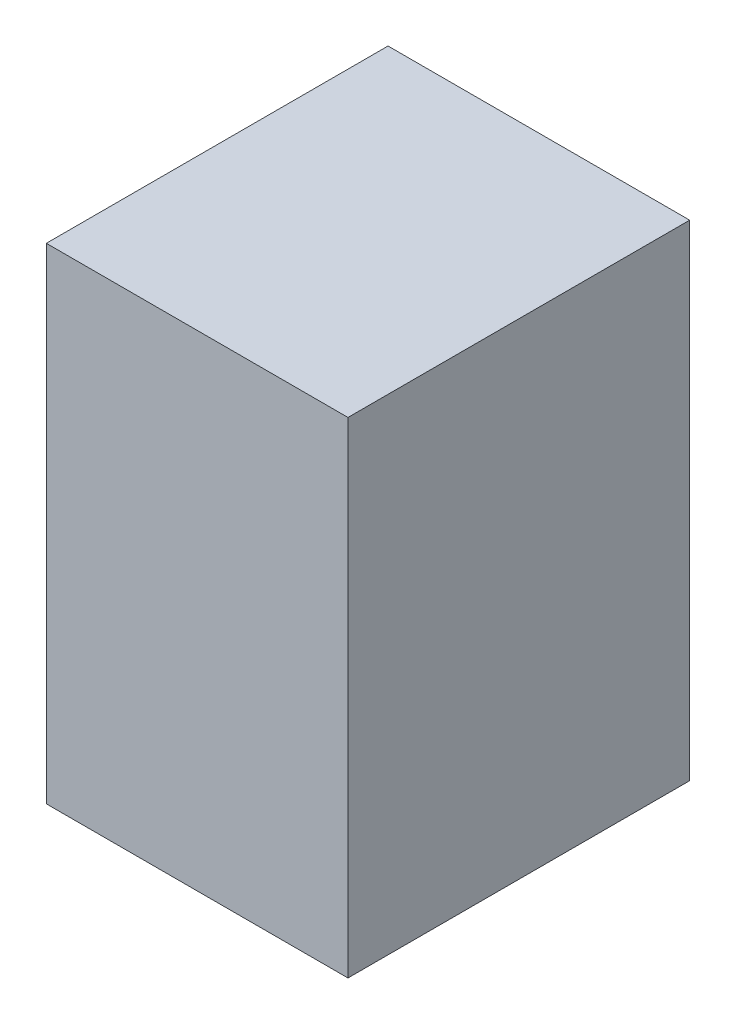
ISO-10303-21;
HEADER;
FILE_DESCRIPTION(('STEP AP214'),'2;1');
FILE_NAME('part.step','',(''),(''),'','','');
FILE_SCHEMA(('AUTOMOTIVE_DESIGN { 1 0 10303 214 1 1 1 1 }'));
ENDSEC;
DATA;
#1=APPLICATION_CONTEXT('core data for automotive mechanical design processes');
#2=APPLICATION_PROTOCOL_DEFINITION('international standard','automotive_design',2000,#1);
#3=PRODUCT_CONTEXT('',#1,'mechanical');
#4=PRODUCT('Part','Part','',(#3));
#5=PRODUCT_RELATED_PRODUCT_CATEGORY('part','',(#4));
#6=PRODUCT_DEFINITION_FORMATION('','',#4);
#7=PRODUCT_DEFINITION_CONTEXT('part definition',#1,'design');
#8=PRODUCT_DEFINITION('design','',#6,#7);
#9=PRODUCT_DEFINITION_SHAPE('','',#8);
#10=(LENGTH_UNIT() NAMED_UNIT(*) SI_UNIT(.MILLI.,.METRE.));
#11=(NAMED_UNIT(*) PLANE_ANGLE_UNIT() SI_UNIT($,.RADIAN.));
#12=(NAMED_UNIT(*) SI_UNIT($,.STERADIAN.) SOLID_ANGLE_UNIT());
#13=UNCERTAINTY_MEASURE_WITH_UNIT(LENGTH_MEASURE(1.E-05),#10,'distance_accuracy_value','');
#14=(GEOMETRIC_REPRESENTATION_CONTEXT(3) GLOBAL_UNCERTAINTY_ASSIGNED_CONTEXT((#13)) GLOBAL_UNIT_ASSIGNED_CONTEXT((#10,
#11,#12)) REPRESENTATION_CONTEXT('',''));
#15=CARTESIAN_POINT('',(0.,0.,0.));
#16=DIRECTION('',(0.,0.,1.));
#17=DIRECTION('',(1.,0.,0.));
#18=AXIS2_PLACEMENT_3D('',#15,#16,#17);
#19=CARTESIAN_POINT('',(32.,103.,36.25));
#20=DIRECTION('',(-1.,0.,0.));
#21=DIRECTION('',(0.,0.,1.));
#22=AXIS2_PLACEMENT_3D('',#19,#20,#21);
#23=PLANE('',#22);
#24=DIRECTION('',(0.,0.,-1.));
#25=VECTOR('',#24,1.);
#26=CARTESIAN_POINT('',(32.,0.,36.25));
#27=LINE('',#26,#25);
#28=CARTESIAN_POINT('',(32.,0.,36.25));
#29=VERTEX_POINT('',#28);
#30=CARTESIAN_POINT('',(32.,0.,-36.25));
#31=VERTEX_POINT('',#30);
#32=EDGE_CURVE('E100',#29,#31,#27,.T.);
#33=ORIENTED_EDGE('',*,*,#32,.T.);
#34=DIRECTION('',(0.,-1.,0.));
#35=VECTOR('',#34,1.);
#36=CARTESIAN_POINT('',(32.,103.,-36.25));
#37=LINE('',#36,#35);
#38=CARTESIAN_POINT('',(32.,103.,-36.25));
#39=VERTEX_POINT('',#38);
#40=EDGE_CURVE('E11',#39,#31,#37,.T.);
#41=ORIENTED_EDGE('',*,*,#40,.F.);
#42=DIRECTION('',(0.,0.,-1.));
#43=VECTOR('',#42,1.);
#44=CARTESIAN_POINT('',(32.,103.,36.25));
#45=LINE('',#44,#43);
#46=CARTESIAN_POINT('',(32.,103.,36.25));
#47=VERTEX_POINT('',#46);
#48=EDGE_CURVE('E88',#47,#39,#45,.T.);
#49=ORIENTED_EDGE('',*,*,#48,.F.);
#50=DIRECTION('',(0.,-1.,0.));
#51=VECTOR('',#50,1.);
#52=CARTESIAN_POINT('',(32.,103.,36.25));
#53=LINE('',#52,#51);
#54=EDGE_CURVE('E96',#47,#29,#53,.T.);
#55=ORIENTED_EDGE('',*,*,#54,.T.);
#56=EDGE_LOOP('',(#33,#41,#49,#55));
#57=FACE_BOUND('',#56,.T.);
#58=ADVANCED_FACE('F37',(#57),#23,.F.);
#59=CARTESIAN_POINT('',(-32.,103.,-36.25));
#60=DIRECTION('',(0.,0.,1.));
#61=DIRECTION('',(1.,0.,0.));
#62=AXIS2_PLACEMENT_3D('',#59,#60,#61);
#63=PLANE('',#62);
#64=DIRECTION('',(-1.,0.,0.));
#65=VECTOR('',#64,1.);
#66=CARTESIAN_POINT('',(-32.,0.,-36.25));
#67=LINE('',#66,#65);
#68=CARTESIAN_POINT('',(-32.,0.,-36.25));
#69=VERTEX_POINT('',#68);
#70=EDGE_CURVE('E92',#31,#69,#67,.T.);
#71=ORIENTED_EDGE('',*,*,#70,.T.);
#72=DIRECTION('',(0.,-1.,0.));
#73=VECTOR('',#72,1.);
#74=CARTESIAN_POINT('',(-32.,103.,-36.25));
#75=LINE('',#74,#73);
#76=CARTESIAN_POINT('',(-32.,103.,-36.25));
#77=VERTEX_POINT('',#76);
#78=EDGE_CURVE('E45',#77,#69,#75,.T.);
#79=ORIENTED_EDGE('',*,*,#78,.F.);
#80=DIRECTION('',(-1.,0.,0.));
#81=VECTOR('',#80,1.);
#82=CARTESIAN_POINT('',(-32.,103.,-36.25));
#83=LINE('',#82,#81);
#84=EDGE_CURVE('E83',#39,#77,#83,.T.);
#85=ORIENTED_EDGE('',*,*,#84,.F.);
#86=ORIENTED_EDGE('',*,*,#40,.T.);
#87=EDGE_LOOP('',(#71,#79,#85,#86));
#88=FACE_BOUND('',#87,.T.);
#89=ADVANCED_FACE('F91',(#88),#63,.F.);
#90=CARTESIAN_POINT('',(-32.,103.,36.25));
#91=DIRECTION('',(1.,0.,0.));
#92=DIRECTION('',(0.,0.,-1.));
#93=AXIS2_PLACEMENT_3D('',#90,#91,#92);
#94=PLANE('',#93);
#95=DIRECTION('',(0.,0.,1.));
#96=VECTOR('',#95,1.);
#97=CARTESIAN_POINT('',(-32.,0.,36.25));
#98=LINE('',#97,#96);
#99=CARTESIAN_POINT('',(-32.,0.,36.25));
#100=VERTEX_POINT('',#99);
#101=EDGE_CURVE('E70',#69,#100,#98,.T.);
#102=ORIENTED_EDGE('',*,*,#101,.T.);
#103=DIRECTION('',(0.,-1.,0.));
#104=VECTOR('',#103,1.);
#105=CARTESIAN_POINT('',(-32.,103.,36.25));
#106=LINE('',#105,#104);
#107=CARTESIAN_POINT('',(-32.,103.,36.25));
#108=VERTEX_POINT('',#107);
#109=EDGE_CURVE('E93',#108,#100,#106,.T.);
#110=ORIENTED_EDGE('',*,*,#109,.F.);
#111=DIRECTION('',(0.,0.,1.));
#112=VECTOR('',#111,1.);
#113=CARTESIAN_POINT('',(-32.,103.,36.25));
#114=LINE('',#113,#112);
#115=EDGE_CURVE('E86',#77,#108,#114,.T.);
#116=ORIENTED_EDGE('',*,*,#115,.F.);
#117=ORIENTED_EDGE('',*,*,#78,.T.);
#118=EDGE_LOOP('',(#102,#110,#116,#117));
#119=FACE_BOUND('',#118,.T.);
#120=ADVANCED_FACE('F94',(#119),#94,.F.);
#121=CARTESIAN_POINT('',(-32.,103.,36.25));
#122=DIRECTION('',(0.,0.,-1.));
#123=DIRECTION('',(-1.,0.,0.));
#124=AXIS2_PLACEMENT_3D('',#121,#122,#123);
#125=PLANE('',#124);
#126=DIRECTION('',(1.,0.,0.));
#127=VECTOR('',#126,1.);
#128=CARTESIAN_POINT('',(-32.,0.,36.25));
#129=LINE('',#128,#127);
#130=EDGE_CURVE('E76',#100,#29,#129,.T.);
#131=ORIENTED_EDGE('',*,*,#130,.T.);
#132=ORIENTED_EDGE('',*,*,#54,.F.);
#133=DIRECTION('',(1.,0.,0.));
#134=VECTOR('',#133,1.);
#135=CARTESIAN_POINT('',(-32.,103.,36.25));
#136=LINE('',#135,#134);
#137=EDGE_CURVE('E53',#108,#47,#136,.T.);
#138=ORIENTED_EDGE('',*,*,#137,.F.);
#139=ORIENTED_EDGE('',*,*,#109,.T.);
#140=EDGE_LOOP('',(#131,#132,#138,#139));
#141=FACE_BOUND('',#140,.T.);
#142=ADVANCED_FACE('F107',(#141),#125,.F.);
#143=CARTESIAN_POINT('',(0.,103.,0.));
#144=DIRECTION('',(0.,-1.,0.));
#145=DIRECTION('',(0.,0.,-1.));
#146=AXIS2_PLACEMENT_3D('',#143,#144,#145);
#147=PLANE('',#146);
#148=ORIENTED_EDGE('',*,*,#48,.T.);
#149=ORIENTED_EDGE('',*,*,#84,.T.);
#150=ORIENTED_EDGE('',*,*,#115,.T.);
#151=ORIENTED_EDGE('',*,*,#137,.T.);
#152=EDGE_LOOP('',(#148,#149,#150,#151));
#153=FACE_BOUND('',#152,.T.);
#154=ADVANCED_FACE('F84',(#153),#147,.F.);
#155=CARTESIAN_POINT('',(0.,0.,0.));
#156=DIRECTION('',(0.,-1.,0.));
#157=DIRECTION('',(0.,0.,-1.));
#158=AXIS2_PLACEMENT_3D('',#155,#156,#157);
#159=PLANE('',#158);
#160=ORIENTED_EDGE('',*,*,#32,.F.);
#161=ORIENTED_EDGE('',*,*,#130,.F.);
#162=ORIENTED_EDGE('',*,*,#101,.F.);
#163=ORIENTED_EDGE('',*,*,#70,.F.);
#164=EDGE_LOOP('',(#160,#161,#162,#163));
#165=FACE_BOUND('',#164,.T.);
#166=ADVANCED_FACE('F110',(#165),#159,.T.);
#167=CLOSED_SHELL('',(#58,#89,#120,#142,#154,#166));
#168=MANIFOLD_SOLID_BREP('B2',#167);
#169=ADVANCED_BREP_SHAPE_REPRESENTATION('',(#18,#168),#14);
#170=SHAPE_DEFINITION_REPRESENTATION(#9,#169);
ENDSEC;
END-ISO-10303-21;
